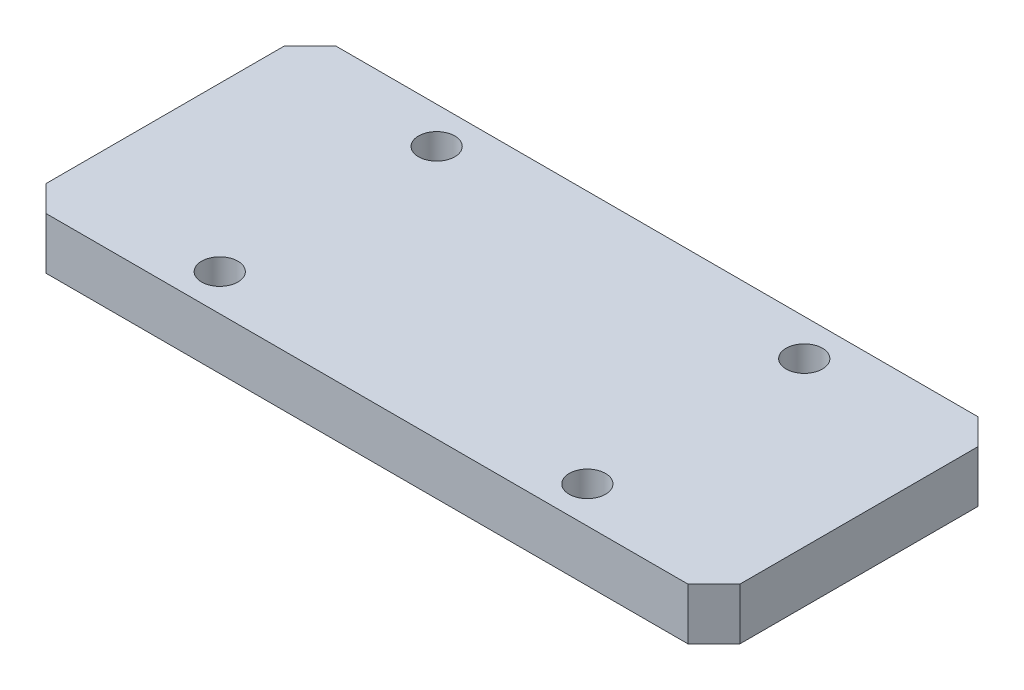
ISO-10303-21;
HEADER;
FILE_DESCRIPTION(('STEP AP214'),'2;1');
FILE_NAME('part.step','',(''),(''),'','','');
FILE_SCHEMA(('AUTOMOTIVE_DESIGN { 1 0 10303 214 1 1 1 1 }'));
ENDSEC;
DATA;
#1=APPLICATION_CONTEXT('core data for automotive mechanical design processes');
#2=APPLICATION_PROTOCOL_DEFINITION('international standard','automotive_design',2000,#1);
#3=PRODUCT_CONTEXT('',#1,'mechanical');
#4=PRODUCT('Part','Part','',(#3));
#5=PRODUCT_RELATED_PRODUCT_CATEGORY('part','',(#4));
#6=PRODUCT_DEFINITION_FORMATION('','',#4);
#7=PRODUCT_DEFINITION_CONTEXT('part definition',#1,'design');
#8=PRODUCT_DEFINITION('design','',#6,#7);
#9=PRODUCT_DEFINITION_SHAPE('','',#8);
#10=(LENGTH_UNIT() NAMED_UNIT(*) SI_UNIT(.MILLI.,.METRE.));
#11=(NAMED_UNIT(*) PLANE_ANGLE_UNIT() SI_UNIT($,.RADIAN.));
#12=(NAMED_UNIT(*) SI_UNIT($,.STERADIAN.) SOLID_ANGLE_UNIT());
#13=UNCERTAINTY_MEASURE_WITH_UNIT(LENGTH_MEASURE(1.E-05),#10,'distance_accuracy_value','');
#14=(GEOMETRIC_REPRESENTATION_CONTEXT(3) GLOBAL_UNCERTAINTY_ASSIGNED_CONTEXT((#13)) GLOBAL_UNIT_ASSIGNED_CONTEXT((#10,
#11,#12)) REPRESENTATION_CONTEXT('',''));
#15=CARTESIAN_POINT('',(0.,0.,0.));
#16=DIRECTION('',(0.,0.,1.));
#17=DIRECTION('',(1.,0.,0.));
#18=AXIS2_PLACEMENT_3D('',#15,#16,#17);
#19=CARTESIAN_POINT('',(67.,9.99999999999999,56.));
#20=DIRECTION('',(-1.,0.,0.));
#21=DIRECTION('',(0.,0.,1.));
#22=AXIS2_PLACEMENT_3D('',#19,#20,#21);
#23=PLANE('',#22);
#24=DIRECTION('',(0.,0.,-1.));
#25=VECTOR('',#24,1.);
#26=CARTESIAN_POINT('',(67.,0.,56.));
#27=LINE('',#26,#25);
#28=CARTESIAN_POINT('',(67.,0.,51.));
#29=VERTEX_POINT('',#28);
#30=CARTESIAN_POINT('',(67.,0.,4.99999999999999));
#31=VERTEX_POINT('',#30);
#32=EDGE_CURVE('E132',#29,#31,#27,.T.);
#33=ORIENTED_EDGE('',*,*,#32,.T.);
#34=DIRECTION('',(0.,1.,0.));
#35=VECTOR('',#34,1.);
#36=CARTESIAN_POINT('',(67.,9.99999999999999,4.99999999999999));
#37=LINE('',#36,#35);
#38=CARTESIAN_POINT('',(67.,9.99999999999999,4.99999999999999));
#39=VERTEX_POINT('',#38);
#40=EDGE_CURVE('E11',#31,#39,#37,.T.);
#41=ORIENTED_EDGE('',*,*,#40,.T.);
#42=DIRECTION('',(0.,0.,-1.));
#43=VECTOR('',#42,1.);
#44=CARTESIAN_POINT('',(67.,9.99999999999999,56.));
#45=LINE('',#44,#43);
#46=CARTESIAN_POINT('',(67.,9.99999999999999,51.));
#47=VERTEX_POINT('',#46);
#48=EDGE_CURVE('E138',#47,#39,#45,.T.);
#49=ORIENTED_EDGE('',*,*,#48,.F.);
#50=DIRECTION('',(0.,-1.,0.));
#51=VECTOR('',#50,1.);
#52=CARTESIAN_POINT('',(67.,9.99999999999999,51.));
#53=LINE('',#52,#51);
#54=EDGE_CURVE('E50',#47,#29,#53,.T.);
#55=ORIENTED_EDGE('',*,*,#54,.T.);
#56=EDGE_LOOP('',(#33,#41,#49,#55));
#57=FACE_BOUND('',#56,.T.);
#58=ADVANCED_FACE('F40',(#57),#23,.F.);
#59=CARTESIAN_POINT('',(-46.,9.99999999999999,56.));
#60=DIRECTION('',(0.,-1.,0.));
#61=DIRECTION('',(1.,0.,0.));
#62=AXIS2_PLACEMENT_3D('',#59,#60,#61);
#63=PLANE('',#62);
#64=CARTESIAN_POINT('',(35.5,10.,7.055));
#65=DIRECTION('',(0.,1.,0.));
#66=DIRECTION('',(-1.,0.,0.));
#67=AXIS2_PLACEMENT_3D('',#64,#65,#66);
#68=CIRCLE('',#67,3.5);
#69=CARTESIAN_POINT('',(32.,10.,7.055));
#70=VERTEX_POINT('',#69);
#71=EDGE_CURVE('E379',#70,#70,#68,.T.);
#72=ORIENTED_EDGE('',*,*,#71,.F.);
#73=EDGE_LOOP('',(#72));
#74=FACE_BOUND('',#73,.T.);
#75=CARTESIAN_POINT('',(-35.5,9.99999999999999,48.945));
#76=DIRECTION('',(0.,1.,0.));
#77=DIRECTION('',(-1.,0.,0.));
#78=AXIS2_PLACEMENT_3D('',#75,#76,#77);
#79=CIRCLE('',#78,3.5);
#80=CARTESIAN_POINT('',(-39.,9.99999999999999,48.945));
#81=VERTEX_POINT('',#80);
#82=EDGE_CURVE('E372',#81,#81,#79,.T.);
#83=ORIENTED_EDGE('',*,*,#82,.F.);
#84=EDGE_LOOP('',(#83));
#85=FACE_BOUND('',#84,.T.);
#86=CARTESIAN_POINT('',(35.5,10.,48.945));
#87=DIRECTION('',(0.,1.,0.));
#88=DIRECTION('',(-1.,0.,0.));
#89=AXIS2_PLACEMENT_3D('',#86,#87,#88);
#90=CIRCLE('',#89,3.5);
#91=CARTESIAN_POINT('',(32.,10.,48.945));
#92=VERTEX_POINT('',#91);
#93=EDGE_CURVE('E367',#92,#92,#90,.T.);
#94=ORIENTED_EDGE('',*,*,#93,.F.);
#95=EDGE_LOOP('',(#94));
#96=FACE_BOUND('',#95,.T.);
#97=CARTESIAN_POINT('',(-35.5,9.99999999999999,7.055));
#98=DIRECTION('',(0.,1.,0.));
#99=DIRECTION('',(-1.,0.,0.));
#100=AXIS2_PLACEMENT_3D('',#97,#98,#99);
#101=CIRCLE('',#100,3.5);
#102=CARTESIAN_POINT('',(-39.,9.99999999999999,7.055));
#103=VERTEX_POINT('',#102);
#104=EDGE_CURVE('E201',#103,#103,#101,.T.);
#105=ORIENTED_EDGE('',*,*,#104,.F.);
#106=EDGE_LOOP('',(#105));
#107=FACE_BOUND('',#106,.T.);
#108=DIRECTION('',(-1.,0.,0.));
#109=VECTOR('',#108,1.);
#110=CARTESIAN_POINT('',(-46.,9.99999999999999,0.));
#111=LINE('',#110,#109);
#112=CARTESIAN_POINT('',(62.,10.,0.));
#113=VERTEX_POINT('',#112);
#114=CARTESIAN_POINT('',(-62.,9.99999999999999,0.));
#115=VERTEX_POINT('',#114);
#116=EDGE_CURVE('E198',#113,#115,#111,.T.);
#117=ORIENTED_EDGE('',*,*,#116,.T.);
#118=DIRECTION('',(-0.707106781186549,0.,0.707106781186546));
#119=VECTOR('',#118,1.);
#120=CARTESIAN_POINT('',(-67.,9.99999999999999,4.99999999999999));
#121=LINE('',#120,#119);
#122=CARTESIAN_POINT('',(-67.,9.99999999999999,4.99999999999999));
#123=VERTEX_POINT('',#122);
#124=EDGE_CURVE('E165',#115,#123,#121,.T.);
#125=ORIENTED_EDGE('',*,*,#124,.T.);
#126=DIRECTION('',(0.,0.,-1.));
#127=VECTOR('',#126,1.);
#128=CARTESIAN_POINT('',(-67.,9.99999999999999,56.));
#129=LINE('',#128,#127);
#130=CARTESIAN_POINT('',(-67.,9.99999999999999,51.));
#131=VERTEX_POINT('',#130);
#132=EDGE_CURVE('E131',#131,#123,#129,.T.);
#133=ORIENTED_EDGE('',*,*,#132,.F.);
#134=DIRECTION('',(-0.707106781186548,0.,-0.707106781186548));
#135=VECTOR('',#134,1.);
#136=CARTESIAN_POINT('',(-62.,9.99999999999999,56.));
#137=LINE('',#136,#135);
#138=CARTESIAN_POINT('',(-62.,10.,56.));
#139=VERTEX_POINT('',#138);
#140=EDGE_CURVE('E136',#131,#139,#137,.F.);
#141=ORIENTED_EDGE('',*,*,#140,.T.);
#142=DIRECTION('',(-1.,0.,0.));
#143=VECTOR('',#142,1.);
#144=CARTESIAN_POINT('',(46.,9.99999999999999,56.));
#145=LINE('',#144,#143);
#146=CARTESIAN_POINT('',(62.,9.99999999999999,56.));
#147=VERTEX_POINT('',#146);
#148=EDGE_CURVE('E189',#147,#139,#145,.T.);
#149=ORIENTED_EDGE('',*,*,#148,.F.);
#150=DIRECTION('',(-0.707106781186548,0.,0.707106781186548));
#151=VECTOR('',#150,1.);
#152=CARTESIAN_POINT('',(62.,10.,56.));
#153=LINE('',#152,#151);
#154=EDGE_CURVE('E64',#147,#47,#153,.F.);
#155=ORIENTED_EDGE('',*,*,#154,.T.);
#156=ORIENTED_EDGE('',*,*,#48,.T.);
#157=DIRECTION('',(-0.70710678118655,0.,-0.707106781186545));
#158=VECTOR('',#157,1.);
#159=CARTESIAN_POINT('',(67.,9.99999999999999,4.99999999999999));
#160=LINE('',#159,#158);
#161=EDGE_CURVE('E57',#39,#113,#160,.T.);
#162=ORIENTED_EDGE('',*,*,#161,.T.);
#163=EDGE_LOOP('',(#117,#125,#133,#141,#149,#155,#156,#162));
#164=FACE_BOUND('',#163,.T.);
#165=ADVANCED_FACE('F191',(#74,#85,#96,#107,#164),#63,.F.);
#166=CARTESIAN_POINT('',(-67.,9.99999999999999,56.));
#167=DIRECTION('',(1.,0.,0.));
#168=DIRECTION('',(0.,0.,-1.));
#169=AXIS2_PLACEMENT_3D('',#166,#167,#168);
#170=PLANE('',#169);
#171=ORIENTED_EDGE('',*,*,#132,.T.);
#172=DIRECTION('',(0.,-1.,0.));
#173=VECTOR('',#172,1.);
#174=CARTESIAN_POINT('',(-67.,0.,4.99999999999999));
#175=LINE('',#174,#173);
#176=CARTESIAN_POINT('',(-67.,0.,4.99999999999999));
#177=VERTEX_POINT('',#176);
#178=EDGE_CURVE('E129',#123,#177,#175,.T.);
#179=ORIENTED_EDGE('',*,*,#178,.T.);
#180=DIRECTION('',(0.,0.,-1.));
#181=VECTOR('',#180,1.);
#182=CARTESIAN_POINT('',(-67.,0.,56.));
#183=LINE('',#182,#181);
#184=CARTESIAN_POINT('',(-67.,0.,51.));
#185=VERTEX_POINT('',#184);
#186=EDGE_CURVE('E111',#185,#177,#183,.T.);
#187=ORIENTED_EDGE('',*,*,#186,.F.);
#188=DIRECTION('',(0.,1.,0.));
#189=VECTOR('',#188,1.);
#190=CARTESIAN_POINT('',(-67.,9.99999999999999,51.));
#191=LINE('',#190,#189);
#192=EDGE_CURVE('E126',#185,#131,#191,.T.);
#193=ORIENTED_EDGE('',*,*,#192,.T.);
#194=EDGE_LOOP('',(#171,#179,#187,#193));
#195=FACE_BOUND('',#194,.T.);
#196=ADVANCED_FACE('F125',(#195),#170,.F.);
#197=CARTESIAN_POINT('',(67.,0.,56.));
#198=DIRECTION('',(0.,1.,0.));
#199=DIRECTION('',(-1.,0.,0.));
#200=AXIS2_PLACEMENT_3D('',#197,#198,#199);
#201=PLANE('',#200);
#202=CARTESIAN_POINT('',(35.5,0.,7.055));
#203=DIRECTION('',(0.,1.,0.));
#204=DIRECTION('',(-1.,0.,0.));
#205=AXIS2_PLACEMENT_3D('',#202,#203,#204);
#206=CIRCLE('',#205,3.5);
#207=CARTESIAN_POINT('',(32.,0.,7.055));
#208=VERTEX_POINT('',#207);
#209=EDGE_CURVE('E375',#208,#208,#206,.T.);
#210=ORIENTED_EDGE('',*,*,#209,.T.);
#211=EDGE_LOOP('',(#210));
#212=FACE_BOUND('',#211,.T.);
#213=CARTESIAN_POINT('',(-35.5,0.,48.945));
#214=DIRECTION('',(0.,1.,0.));
#215=DIRECTION('',(-1.,0.,0.));
#216=AXIS2_PLACEMENT_3D('',#213,#214,#215);
#217=CIRCLE('',#216,3.5);
#218=CARTESIAN_POINT('',(-39.,0.,48.945));
#219=VERTEX_POINT('',#218);
#220=EDGE_CURVE('E383',#219,#219,#217,.T.);
#221=ORIENTED_EDGE('',*,*,#220,.T.);
#222=EDGE_LOOP('',(#221));
#223=FACE_BOUND('',#222,.T.);
#224=CARTESIAN_POINT('',(35.5,0.,48.945));
#225=DIRECTION('',(0.,1.,0.));
#226=DIRECTION('',(-1.,0.,0.));
#227=AXIS2_PLACEMENT_3D('',#224,#225,#226);
#228=CIRCLE('',#227,3.5);
#229=CARTESIAN_POINT('',(32.,0.,48.945));
#230=VERTEX_POINT('',#229);
#231=EDGE_CURVE('E364',#230,#230,#228,.T.);
#232=ORIENTED_EDGE('',*,*,#231,.T.);
#233=EDGE_LOOP('',(#232));
#234=FACE_BOUND('',#233,.T.);
#235=CARTESIAN_POINT('',(-35.5,0.,7.055));
#236=DIRECTION('',(0.,1.,0.));
#237=DIRECTION('',(-1.,0.,0.));
#238=AXIS2_PLACEMENT_3D('',#235,#236,#237);
#239=CIRCLE('',#238,3.5);
#240=CARTESIAN_POINT('',(-39.,0.,7.055));
#241=VERTEX_POINT('',#240);
#242=EDGE_CURVE('E205',#241,#241,#239,.T.);
#243=ORIENTED_EDGE('',*,*,#242,.T.);
#244=EDGE_LOOP('',(#243));
#245=FACE_BOUND('',#244,.T.);
#246=ORIENTED_EDGE('',*,*,#186,.T.);
#247=DIRECTION('',(0.707106781186549,0.,-0.707106781186546));
#248=VECTOR('',#247,1.);
#249=CARTESIAN_POINT('',(-67.,0.,4.99999999999999));
#250=LINE('',#249,#248);
#251=CARTESIAN_POINT('',(-62.,0.,0.));
#252=VERTEX_POINT('',#251);
#253=EDGE_CURVE('E119',#177,#252,#250,.T.);
#254=ORIENTED_EDGE('',*,*,#253,.T.);
#255=DIRECTION('',(1.,0.,0.));
#256=VECTOR('',#255,1.);
#257=CARTESIAN_POINT('',(67.,0.,0.));
#258=LINE('',#257,#256);
#259=CARTESIAN_POINT('',(62.,0.,0.));
#260=VERTEX_POINT('',#259);
#261=EDGE_CURVE('E193',#252,#260,#258,.T.);
#262=ORIENTED_EDGE('',*,*,#261,.T.);
#263=DIRECTION('',(0.70710678118655,0.,0.707106781186545));
#264=VECTOR('',#263,1.);
#265=CARTESIAN_POINT('',(67.,0.,4.99999999999999));
#266=LINE('',#265,#264);
#267=EDGE_CURVE('E120',#260,#31,#266,.T.);
#268=ORIENTED_EDGE('',*,*,#267,.T.);
#269=ORIENTED_EDGE('',*,*,#32,.F.);
#270=DIRECTION('',(0.707106781186548,0.,-0.707106781186548));
#271=VECTOR('',#270,1.);
#272=CARTESIAN_POINT('',(62.,0.,56.));
#273=LINE('',#272,#271);
#274=CARTESIAN_POINT('',(62.,0.,56.));
#275=VERTEX_POINT('',#274);
#276=EDGE_CURVE('E142',#29,#275,#273,.F.);
#277=ORIENTED_EDGE('',*,*,#276,.T.);
#278=DIRECTION('',(1.,0.,0.));
#279=VECTOR('',#278,1.);
#280=CARTESIAN_POINT('',(-67.,0.,56.));
#281=LINE('',#280,#279);
#282=CARTESIAN_POINT('',(-62.,0.,56.));
#283=VERTEX_POINT('',#282);
#284=EDGE_CURVE('E113',#283,#275,#281,.T.);
#285=ORIENTED_EDGE('',*,*,#284,.F.);
#286=DIRECTION('',(0.707106781186548,0.,0.707106781186548));
#287=VECTOR('',#286,1.);
#288=CARTESIAN_POINT('',(-62.,0.,56.));
#289=LINE('',#288,#287);
#290=EDGE_CURVE('E108',#283,#185,#289,.F.);
#291=ORIENTED_EDGE('',*,*,#290,.T.);
#292=EDGE_LOOP('',(#246,#254,#262,#268,#269,#277,#285,#291));
#293=FACE_BOUND('',#292,.T.);
#294=ADVANCED_FACE('F110',(#212,#223,#234,#245,#293),#201,.F.);
#295=CARTESIAN_POINT('',(0.,0.,56.));
#296=DIRECTION('',(0.,0.,-1.));
#297=DIRECTION('',(-1.,0.,0.));
#298=AXIS2_PLACEMENT_3D('',#295,#296,#297);
#299=PLANE('',#298);
#300=ORIENTED_EDGE('',*,*,#148,.T.);
#301=DIRECTION('',(0.,-1.,0.));
#302=VECTOR('',#301,1.);
#303=CARTESIAN_POINT('',(-62.,0.,56.));
#304=LINE('',#303,#302);
#305=EDGE_CURVE('E172',#139,#283,#304,.T.);
#306=ORIENTED_EDGE('',*,*,#305,.T.);
#307=ORIENTED_EDGE('',*,*,#284,.T.);
#308=DIRECTION('',(0.,1.,0.));
#309=VECTOR('',#308,1.);
#310=CARTESIAN_POINT('',(62.,0.,56.));
#311=LINE('',#310,#309);
#312=EDGE_CURVE('E168',#275,#147,#311,.T.);
#313=ORIENTED_EDGE('',*,*,#312,.T.);
#314=EDGE_LOOP('',(#300,#306,#307,#313));
#315=FACE_BOUND('',#314,.T.);
#316=ADVANCED_FACE('F188',(#315),#299,.F.);
#317=CARTESIAN_POINT('',(0.,0.,0.));
#318=DIRECTION('',(0.,0.,-1.));
#319=DIRECTION('',(-1.,0.,0.));
#320=AXIS2_PLACEMENT_3D('',#317,#318,#319);
#321=PLANE('',#320);
#322=ORIENTED_EDGE('',*,*,#261,.F.);
#323=DIRECTION('',(0.,1.,0.));
#324=VECTOR('',#323,1.);
#325=CARTESIAN_POINT('',(-62.,9.99999999999999,0.));
#326=LINE('',#325,#324);
#327=EDGE_CURVE('E156',#252,#115,#326,.T.);
#328=ORIENTED_EDGE('',*,*,#327,.T.);
#329=ORIENTED_EDGE('',*,*,#116,.F.);
#330=DIRECTION('',(0.,-1.,0.));
#331=VECTOR('',#330,1.);
#332=CARTESIAN_POINT('',(62.,0.,0.));
#333=LINE('',#332,#331);
#334=EDGE_CURVE('E153',#113,#260,#333,.T.);
#335=ORIENTED_EDGE('',*,*,#334,.T.);
#336=EDGE_LOOP('',(#322,#328,#329,#335));
#337=FACE_BOUND('',#336,.T.);
#338=ADVANCED_FACE('F213',(#337),#321,.T.);
#339=CARTESIAN_POINT('',(-35.5,0.,7.055));
#340=DIRECTION('',(0.,1.,0.));
#341=DIRECTION('',(-1.,0.,0.));
#342=AXIS2_PLACEMENT_3D('',#339,#340,#341);
#343=CYLINDRICAL_SURFACE('',#342,3.5);
#344=ORIENTED_EDGE('',*,*,#242,.F.);
#345=EDGE_LOOP('',(#344));
#346=FACE_BOUND('',#345,.T.);
#347=ORIENTED_EDGE('',*,*,#104,.T.);
#348=EDGE_LOOP('',(#347));
#349=FACE_BOUND('',#348,.T.);
#350=ADVANCED_FACE('F260',(#346,#349),#343,.F.);
#351=CARTESIAN_POINT('',(35.5,0.,48.945));
#352=DIRECTION('',(0.,1.,0.));
#353=DIRECTION('',(-1.,0.,0.));
#354=AXIS2_PLACEMENT_3D('',#351,#352,#353);
#355=CYLINDRICAL_SURFACE('',#354,3.5);
#356=ORIENTED_EDGE('',*,*,#231,.F.);
#357=EDGE_LOOP('',(#356));
#358=FACE_BOUND('',#357,.T.);
#359=ORIENTED_EDGE('',*,*,#93,.T.);
#360=EDGE_LOOP('',(#359));
#361=FACE_BOUND('',#360,.T.);
#362=ADVANCED_FACE('F253',(#358,#361),#355,.F.);
#363=CARTESIAN_POINT('',(-35.5,0.,48.945));
#364=DIRECTION('',(0.,1.,0.));
#365=DIRECTION('',(-1.,0.,0.));
#366=AXIS2_PLACEMENT_3D('',#363,#364,#365);
#367=CYLINDRICAL_SURFACE('',#366,3.5);
#368=ORIENTED_EDGE('',*,*,#220,.F.);
#369=EDGE_LOOP('',(#368));
#370=FACE_BOUND('',#369,.T.);
#371=ORIENTED_EDGE('',*,*,#82,.T.);
#372=EDGE_LOOP('',(#371));
#373=FACE_BOUND('',#372,.T.);
#374=ADVANCED_FACE('F248',(#370,#373),#367,.F.);
#375=CARTESIAN_POINT('',(35.5,0.,7.055));
#376=DIRECTION('',(0.,1.,0.));
#377=DIRECTION('',(-1.,0.,0.));
#378=AXIS2_PLACEMENT_3D('',#375,#376,#377);
#379=CYLINDRICAL_SURFACE('',#378,3.5);
#380=ORIENTED_EDGE('',*,*,#209,.F.);
#381=EDGE_LOOP('',(#380));
#382=FACE_BOUND('',#381,.T.);
#383=ORIENTED_EDGE('',*,*,#71,.T.);
#384=EDGE_LOOP('',(#383));
#385=FACE_BOUND('',#384,.T.);
#386=ADVANCED_FACE('F238',(#382,#385),#379,.F.);
#387=CARTESIAN_POINT('',(-67.,9.99999999999999,4.99999999999999));
#388=DIRECTION('',(-0.707106781186546,0.,-0.707106781186549));
#389=DIRECTION('',(0.,1.,0.));
#390=AXIS2_PLACEMENT_3D('',#387,#388,#389);
#391=PLANE('',#390);
#392=ORIENTED_EDGE('',*,*,#124,.F.);
#393=ORIENTED_EDGE('',*,*,#327,.F.);
#394=ORIENTED_EDGE('',*,*,#253,.F.);
#395=ORIENTED_EDGE('',*,*,#178,.F.);
#396=EDGE_LOOP('',(#392,#393,#394,#395));
#397=FACE_BOUND('',#396,.T.);
#398=ADVANCED_FACE('F209',(#397),#391,.T.);
#399=CARTESIAN_POINT('',(-62.,0.,56.));
#400=DIRECTION('',(0.707106781186547,0.,-0.707106781186547));
#401=DIRECTION('',(0.,-1.,0.));
#402=AXIS2_PLACEMENT_3D('',#399,#400,#401);
#403=PLANE('',#402);
#404=ORIENTED_EDGE('',*,*,#140,.F.);
#405=ORIENTED_EDGE('',*,*,#192,.F.);
#406=ORIENTED_EDGE('',*,*,#290,.F.);
#407=ORIENTED_EDGE('',*,*,#305,.F.);
#408=EDGE_LOOP('',(#404,#405,#406,#407));
#409=FACE_BOUND('',#408,.T.);
#410=ADVANCED_FACE('F135',(#409),#403,.F.);
#411=CARTESIAN_POINT('',(67.,9.99999999999999,4.99999999999999));
#412=DIRECTION('',(0.707106781186545,0.,-0.70710678118655));
#413=DIRECTION('',(0.,-1.,0.));
#414=AXIS2_PLACEMENT_3D('',#411,#412,#413);
#415=PLANE('',#414);
#416=ORIENTED_EDGE('',*,*,#267,.F.);
#417=ORIENTED_EDGE('',*,*,#334,.F.);
#418=ORIENTED_EDGE('',*,*,#161,.F.);
#419=ORIENTED_EDGE('',*,*,#40,.F.);
#420=EDGE_LOOP('',(#416,#417,#418,#419));
#421=FACE_BOUND('',#420,.T.);
#422=ADVANCED_FACE('F215',(#421),#415,.T.);
#423=CARTESIAN_POINT('',(62.,0.,56.));
#424=DIRECTION('',(-0.707106781186547,0.,-0.707106781186547));
#425=DIRECTION('',(0.,1.,0.));
#426=AXIS2_PLACEMENT_3D('',#423,#424,#425);
#427=PLANE('',#426);
#428=ORIENTED_EDGE('',*,*,#276,.F.);
#429=ORIENTED_EDGE('',*,*,#54,.F.);
#430=ORIENTED_EDGE('',*,*,#154,.F.);
#431=ORIENTED_EDGE('',*,*,#312,.F.);
#432=EDGE_LOOP('',(#428,#429,#430,#431));
#433=FACE_BOUND('',#432,.T.);
#434=ADVANCED_FACE('F43',(#433),#427,.F.);
#435=CLOSED_SHELL('',(#58,#165,#196,#294,#316,#338,#350,#362,#374,#386,#398,#410,#422,#434));
#436=MANIFOLD_SOLID_BREP('B2',#435);
#437=ADVANCED_BREP_SHAPE_REPRESENTATION('',(#18,#436),#14);
#438=SHAPE_DEFINITION_REPRESENTATION(#9,#437);
ENDSEC;
END-ISO-10303-21;
